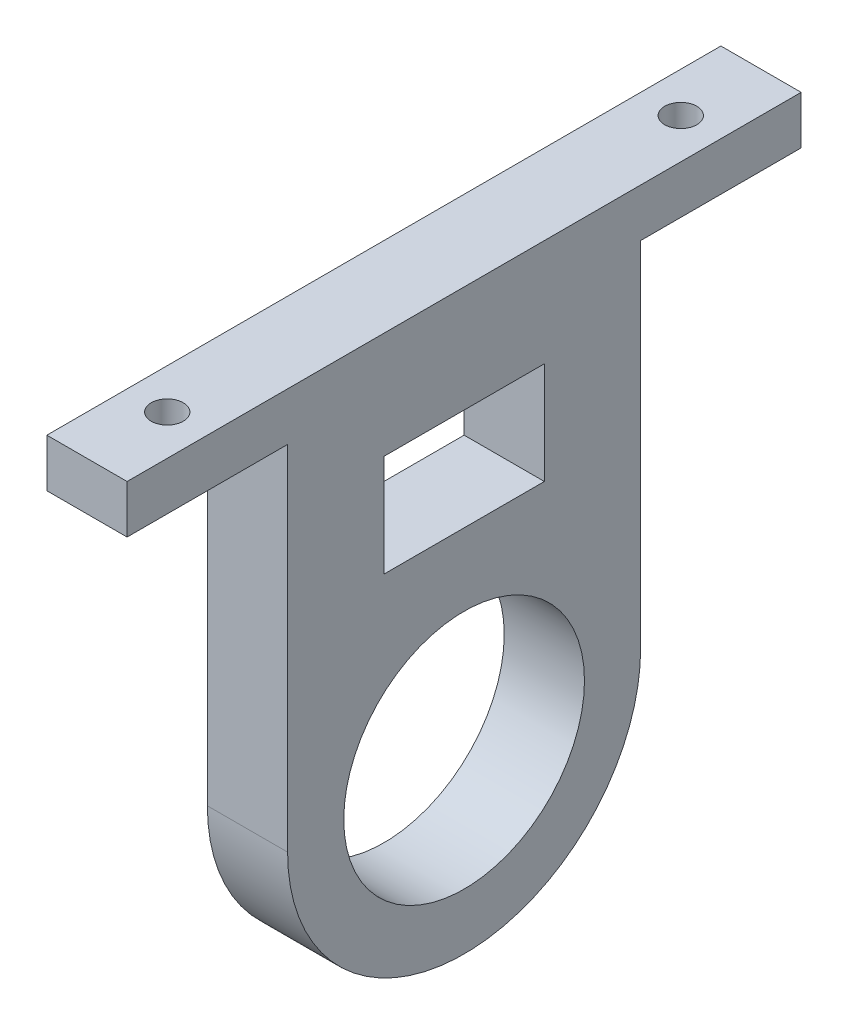
ISO-10303-21;
HEADER;
FILE_DESCRIPTION(('STEP AP214'),'2;1');
FILE_NAME('part.step','',(''),(''),'','','');
FILE_SCHEMA(('AUTOMOTIVE_DESIGN { 1 0 10303 214 1 1 1 1 }'));
ENDSEC;
DATA;
#1=APPLICATION_CONTEXT('core data for automotive mechanical design processes');
#2=APPLICATION_PROTOCOL_DEFINITION('international standard','automotive_design',2000,#1);
#3=PRODUCT_CONTEXT('',#1,'mechanical');
#4=PRODUCT('Part','Part','',(#3));
#5=PRODUCT_RELATED_PRODUCT_CATEGORY('part','',(#4));
#6=PRODUCT_DEFINITION_FORMATION('','',#4);
#7=PRODUCT_DEFINITION_CONTEXT('part definition',#1,'design');
#8=PRODUCT_DEFINITION('design','',#6,#7);
#9=PRODUCT_DEFINITION_SHAPE('','',#8);
#10=(LENGTH_UNIT() NAMED_UNIT(*) SI_UNIT(.MILLI.,.METRE.));
#11=(NAMED_UNIT(*) PLANE_ANGLE_UNIT() SI_UNIT($,.RADIAN.));
#12=(NAMED_UNIT(*) SI_UNIT($,.STERADIAN.) SOLID_ANGLE_UNIT());
#13=UNCERTAINTY_MEASURE_WITH_UNIT(LENGTH_MEASURE(1.E-05),#10,'distance_accuracy_value','');
#14=(GEOMETRIC_REPRESENTATION_CONTEXT(3) GLOBAL_UNCERTAINTY_ASSIGNED_CONTEXT((#13)) GLOBAL_UNIT_ASSIGNED_CONTEXT((#10,
#11,#12)) REPRESENTATION_CONTEXT('',''));
#15=CARTESIAN_POINT('',(0.,0.,0.));
#16=DIRECTION('',(0.,0.,1.));
#17=DIRECTION('',(1.,0.,0.));
#18=AXIS2_PLACEMENT_3D('',#15,#16,#17);
#19=CARTESIAN_POINT('',(5.,0.,0.));
#20=DIRECTION('',(1.,0.,0.));
#21=DIRECTION('',(0.,0.,-1.));
#22=AXIS2_PLACEMENT_3D('',#19,#20,#21);
#23=PLANE('',#22);
#24=CARTESIAN_POINT('',(5.,0.,0.));
#25=DIRECTION('',(1.,0.,0.));
#26=DIRECTION('',(0.,0.,-1.));
#27=AXIS2_PLACEMENT_3D('',#24,#25,#26);
#28=CIRCLE('',#27,11.);
#29=CARTESIAN_POINT('',(5.,0.,11.));
#30=VERTEX_POINT('',#29);
#31=CARTESIAN_POINT('',(5.,0.,-11.));
#32=VERTEX_POINT('',#31);
#33=EDGE_CURVE('E12',#30,#32,#28,.T.);
#34=ORIENTED_EDGE('',*,*,#33,.T.);
#35=DIRECTION('',(0.,1.,0.));
#36=VECTOR('',#35,1.);
#37=CARTESIAN_POINT('',(5.,0.,-11.));
#38=LINE('',#37,#36);
#39=CARTESIAN_POINT('',(5.,22.,-11.));
#40=VERTEX_POINT('',#39);
#41=EDGE_CURVE('E217',#32,#40,#38,.T.);
#42=ORIENTED_EDGE('',*,*,#41,.T.);
#43=DIRECTION('',(0.,0.,1.));
#44=VECTOR('',#43,1.);
#45=CARTESIAN_POINT('',(5.,22.,-21.));
#46=LINE('',#45,#44);
#47=CARTESIAN_POINT('',(5.,22.,-21.));
#48=VERTEX_POINT('',#47);
#49=EDGE_CURVE('E212',#48,#40,#46,.T.);
#50=ORIENTED_EDGE('',*,*,#49,.F.);
#51=DIRECTION('',(0.,-1.,0.));
#52=VECTOR('',#51,1.);
#53=CARTESIAN_POINT('',(5.,25.,-21.));
#54=LINE('',#53,#52);
#55=CARTESIAN_POINT('',(5.,25.,-21.));
#56=VERTEX_POINT('',#55);
#57=EDGE_CURVE('E204',#56,#48,#54,.T.);
#58=ORIENTED_EDGE('',*,*,#57,.F.);
#59=DIRECTION('',(0.,0.,-1.));
#60=VECTOR('',#59,1.);
#61=CARTESIAN_POINT('',(5.,25.,0.));
#62=LINE('',#61,#60);
#63=CARTESIAN_POINT('',(5.,25.,21.));
#64=VERTEX_POINT('',#63);
#65=EDGE_CURVE('E221',#64,#56,#62,.T.);
#66=ORIENTED_EDGE('',*,*,#65,.F.);
#67=DIRECTION('',(0.,-1.,0.));
#68=VECTOR('',#67,1.);
#69=CARTESIAN_POINT('',(5.,25.,21.));
#70=LINE('',#69,#68);
#71=CARTESIAN_POINT('',(5.,22.,21.));
#72=VERTEX_POINT('',#71);
#73=EDGE_CURVE('E185',#64,#72,#70,.T.);
#74=ORIENTED_EDGE('',*,*,#73,.T.);
#75=DIRECTION('',(0.,0.,1.));
#76=VECTOR('',#75,1.);
#77=CARTESIAN_POINT('',(5.,22.,11.));
#78=LINE('',#77,#76);
#79=CARTESIAN_POINT('',(5.,22.,11.));
#80=VERTEX_POINT('',#79);
#81=EDGE_CURVE('E190',#80,#72,#78,.T.);
#82=ORIENTED_EDGE('',*,*,#81,.F.);
#83=DIRECTION('',(0.,1.,0.));
#84=VECTOR('',#83,1.);
#85=CARTESIAN_POINT('',(5.,0.,11.));
#86=LINE('',#85,#84);
#87=EDGE_CURVE('E215',#30,#80,#86,.T.);
#88=ORIENTED_EDGE('',*,*,#87,.F.);
#89=EDGE_LOOP('',(#34,#42,#50,#58,#66,#74,#82,#88));
#90=FACE_BOUND('',#89,.T.);
#91=CARTESIAN_POINT('',(5.,0.,0.));
#92=DIRECTION('',(1.,0.,0.));
#93=DIRECTION('',(0.,0.,-1.));
#94=AXIS2_PLACEMENT_3D('',#91,#92,#93);
#95=CIRCLE('',#94,7.5);
#96=CARTESIAN_POINT('',(5.,0.,-7.5));
#97=VERTEX_POINT('',#96);
#98=EDGE_CURVE('E236',#97,#97,#95,.T.);
#99=ORIENTED_EDGE('',*,*,#98,.F.);
#100=EDGE_LOOP('',(#99));
#101=FACE_BOUND('',#100,.T.);
#102=DIRECTION('',(0.,1.,0.));
#103=VECTOR('',#102,1.);
#104=CARTESIAN_POINT('',(5.,12.,5.));
#105=LINE('',#104,#103);
#106=CARTESIAN_POINT('',(5.,12.,5.));
#107=VERTEX_POINT('',#106);
#108=CARTESIAN_POINT('',(5.,18.3540248627732,5.));
#109=VERTEX_POINT('',#108);
#110=EDGE_CURVE('E146',#107,#109,#105,.T.);
#111=ORIENTED_EDGE('',*,*,#110,.T.);
#112=DIRECTION('',(0.,0.,-1.));
#113=VECTOR('',#112,1.);
#114=CARTESIAN_POINT('',(5.,18.3540248627732,5.));
#115=LINE('',#114,#113);
#116=CARTESIAN_POINT('',(5.,18.3540248627732,-5.));
#117=VERTEX_POINT('',#116);
#118=EDGE_CURVE('E63',#109,#117,#115,.T.);
#119=ORIENTED_EDGE('',*,*,#118,.T.);
#120=DIRECTION('',(0.,1.,0.));
#121=VECTOR('',#120,1.);
#122=CARTESIAN_POINT('',(5.,12.,-5.));
#123=LINE('',#122,#121);
#124=CARTESIAN_POINT('',(5.,12.,-5.));
#125=VERTEX_POINT('',#124);
#126=EDGE_CURVE('E152',#125,#117,#123,.T.);
#127=ORIENTED_EDGE('',*,*,#126,.F.);
#128=DIRECTION('',(0.,0.,-1.));
#129=VECTOR('',#128,1.);
#130=CARTESIAN_POINT('',(5.,12.,5.));
#131=LINE('',#130,#129);
#132=EDGE_CURVE('E164',#107,#125,#131,.T.);
#133=ORIENTED_EDGE('',*,*,#132,.F.);
#134=EDGE_LOOP('',(#111,#119,#127,#133));
#135=FACE_BOUND('',#134,.T.);
#136=ADVANCED_FACE('F46',(#90,#101,#135),#23,.T.);
#137=CARTESIAN_POINT('',(0.,0.,0.));
#138=DIRECTION('',(1.,0.,0.));
#139=DIRECTION('',(0.,0.,-1.));
#140=AXIS2_PLACEMENT_3D('',#137,#138,#139);
#141=PLANE('',#140);
#142=CARTESIAN_POINT('',(0.,0.,0.));
#143=DIRECTION('',(1.,0.,0.));
#144=DIRECTION('',(0.,0.,-1.));
#145=AXIS2_PLACEMENT_3D('',#142,#143,#144);
#146=CIRCLE('',#145,7.5);
#147=CARTESIAN_POINT('',(0.,0.,-7.5));
#148=VERTEX_POINT('',#147);
#149=EDGE_CURVE('E235',#148,#148,#146,.T.);
#150=ORIENTED_EDGE('',*,*,#149,.T.);
#151=EDGE_LOOP('',(#150));
#152=FACE_BOUND('',#151,.T.);
#153=CARTESIAN_POINT('',(0.,0.,0.));
#154=DIRECTION('',(1.,0.,0.));
#155=DIRECTION('',(0.,0.,-1.));
#156=AXIS2_PLACEMENT_3D('',#153,#154,#155);
#157=CIRCLE('',#156,11.);
#158=CARTESIAN_POINT('',(0.,0.,11.));
#159=VERTEX_POINT('',#158);
#160=CARTESIAN_POINT('',(0.,0.,-11.));
#161=VERTEX_POINT('',#160);
#162=EDGE_CURVE('E55',#159,#161,#157,.T.);
#163=ORIENTED_EDGE('',*,*,#162,.F.);
#164=DIRECTION('',(0.,1.,0.));
#165=VECTOR('',#164,1.);
#166=CARTESIAN_POINT('',(0.,0.,11.));
#167=LINE('',#166,#165);
#168=CARTESIAN_POINT('',(0.,22.,11.));
#169=VERTEX_POINT('',#168);
#170=EDGE_CURVE('E214',#159,#169,#167,.T.);
#171=ORIENTED_EDGE('',*,*,#170,.T.);
#172=DIRECTION('',(0.,0.,1.));
#173=VECTOR('',#172,1.);
#174=CARTESIAN_POINT('',(0.,22.,11.));
#175=LINE('',#174,#173);
#176=CARTESIAN_POINT('',(0.,22.,21.));
#177=VERTEX_POINT('',#176);
#178=EDGE_CURVE('E177',#169,#177,#175,.T.);
#179=ORIENTED_EDGE('',*,*,#178,.T.);
#180=DIRECTION('',(0.,1.,0.));
#181=VECTOR('',#180,1.);
#182=CARTESIAN_POINT('',(0.,25.,21.));
#183=LINE('',#182,#181);
#184=CARTESIAN_POINT('',(0.,25.,21.));
#185=VERTEX_POINT('',#184);
#186=EDGE_CURVE('E179',#177,#185,#183,.T.);
#187=ORIENTED_EDGE('',*,*,#186,.T.);
#188=DIRECTION('',(0.,0.,-1.));
#189=VECTOR('',#188,1.);
#190=CARTESIAN_POINT('',(0.,25.,0.));
#191=LINE('',#190,#189);
#192=CARTESIAN_POINT('',(0.,25.,-21.));
#193=VERTEX_POINT('',#192);
#194=EDGE_CURVE('E218',#185,#193,#191,.T.);
#195=ORIENTED_EDGE('',*,*,#194,.T.);
#196=DIRECTION('',(0.,1.,0.));
#197=VECTOR('',#196,1.);
#198=CARTESIAN_POINT('',(0.,25.,-21.));
#199=LINE('',#198,#197);
#200=CARTESIAN_POINT('',(0.,22.,-21.));
#201=VERTEX_POINT('',#200);
#202=EDGE_CURVE('E197',#201,#193,#199,.T.);
#203=ORIENTED_EDGE('',*,*,#202,.F.);
#204=DIRECTION('',(0.,0.,1.));
#205=VECTOR('',#204,1.);
#206=CARTESIAN_POINT('',(0.,22.,-21.));
#207=LINE('',#206,#205);
#208=CARTESIAN_POINT('',(0.,22.,-11.));
#209=VERTEX_POINT('',#208);
#210=EDGE_CURVE('E208',#201,#209,#207,.T.);
#211=ORIENTED_EDGE('',*,*,#210,.T.);
#212=DIRECTION('',(0.,1.,0.));
#213=VECTOR('',#212,1.);
#214=CARTESIAN_POINT('',(0.,0.,-11.));
#215=LINE('',#214,#213);
#216=EDGE_CURVE('E226',#161,#209,#215,.T.);
#217=ORIENTED_EDGE('',*,*,#216,.F.);
#218=EDGE_LOOP('',(#163,#171,#179,#187,#195,#203,#211,#217));
#219=FACE_BOUND('',#218,.T.);
#220=DIRECTION('',(0.,0.,-1.));
#221=VECTOR('',#220,1.);
#222=CARTESIAN_POINT('',(0.,18.3540248627732,5.));
#223=LINE('',#222,#221);
#224=CARTESIAN_POINT('',(0.,18.3540248627732,5.));
#225=VERTEX_POINT('',#224);
#226=CARTESIAN_POINT('',(0.,18.3540248627732,-5.));
#227=VERTEX_POINT('',#226);
#228=EDGE_CURVE('E136',#225,#227,#223,.T.);
#229=ORIENTED_EDGE('',*,*,#228,.F.);
#230=DIRECTION('',(0.,1.,0.));
#231=VECTOR('',#230,1.);
#232=CARTESIAN_POINT('',(0.,12.,5.));
#233=LINE('',#232,#231);
#234=CARTESIAN_POINT('',(0.,12.,5.));
#235=VERTEX_POINT('',#234);
#236=EDGE_CURVE('E158',#235,#225,#233,.T.);
#237=ORIENTED_EDGE('',*,*,#236,.F.);
#238=DIRECTION('',(0.,0.,-1.));
#239=VECTOR('',#238,1.);
#240=CARTESIAN_POINT('',(0.,12.,5.));
#241=LINE('',#240,#239);
#242=CARTESIAN_POINT('',(0.,12.,-5.));
#243=VERTEX_POINT('',#242);
#244=EDGE_CURVE('E71',#235,#243,#241,.T.);
#245=ORIENTED_EDGE('',*,*,#244,.T.);
#246=DIRECTION('',(0.,1.,0.));
#247=VECTOR('',#246,1.);
#248=CARTESIAN_POINT('',(0.,12.,-5.));
#249=LINE('',#248,#247);
#250=EDGE_CURVE('E145',#243,#227,#249,.T.);
#251=ORIENTED_EDGE('',*,*,#250,.T.);
#252=EDGE_LOOP('',(#229,#237,#245,#251));
#253=FACE_BOUND('',#252,.T.);
#254=ADVANCED_FACE('F156',(#152,#219,#253),#141,.F.);
#255=CARTESIAN_POINT('',(5.,0.,11.));
#256=DIRECTION('',(0.,0.,1.));
#257=DIRECTION('',(1.,0.,0.));
#258=AXIS2_PLACEMENT_3D('',#255,#256,#257);
#259=PLANE('',#258);
#260=ORIENTED_EDGE('',*,*,#87,.T.);
#261=DIRECTION('',(-1.,0.,0.));
#262=VECTOR('',#261,1.);
#263=CARTESIAN_POINT('',(0.,22.,11.));
#264=LINE('',#263,#262);
#265=EDGE_CURVE('E175',#80,#169,#264,.T.);
#266=ORIENTED_EDGE('',*,*,#265,.T.);
#267=ORIENTED_EDGE('',*,*,#170,.F.);
#268=DIRECTION('',(-1.,0.,0.));
#269=VECTOR('',#268,1.);
#270=CARTESIAN_POINT('',(5.,0.,11.));
#271=LINE('',#270,#269);
#272=EDGE_CURVE('E232',#30,#159,#271,.T.);
#273=ORIENTED_EDGE('',*,*,#272,.F.);
#274=EDGE_LOOP('',(#260,#266,#267,#273));
#275=FACE_BOUND('',#274,.T.);
#276=ADVANCED_FACE('F268',(#275),#259,.T.);
#277=CARTESIAN_POINT('',(5.,0.,-11.));
#278=DIRECTION('',(0.,0.,1.));
#279=DIRECTION('',(1.,0.,0.));
#280=AXIS2_PLACEMENT_3D('',#277,#278,#279);
#281=PLANE('',#280);
#282=DIRECTION('',(-1.,0.,0.));
#283=VECTOR('',#282,1.);
#284=CARTESIAN_POINT('',(0.,22.,-11.));
#285=LINE('',#284,#283);
#286=EDGE_CURVE('E201',#40,#209,#285,.T.);
#287=ORIENTED_EDGE('',*,*,#286,.F.);
#288=ORIENTED_EDGE('',*,*,#41,.F.);
#289=DIRECTION('',(-1.,0.,0.));
#290=VECTOR('',#289,1.);
#291=CARTESIAN_POINT('',(5.,0.,-11.));
#292=LINE('',#291,#290);
#293=EDGE_CURVE('E223',#32,#161,#292,.T.);
#294=ORIENTED_EDGE('',*,*,#293,.T.);
#295=ORIENTED_EDGE('',*,*,#216,.T.);
#296=EDGE_LOOP('',(#287,#288,#294,#295));
#297=FACE_BOUND('',#296,.T.);
#298=ADVANCED_FACE('F279',(#297),#281,.F.);
#299=CARTESIAN_POINT('',(5.,0.,0.));
#300=DIRECTION('',(-1.,0.,0.));
#301=DIRECTION('',(0.,0.,1.));
#302=AXIS2_PLACEMENT_3D('',#299,#300,#301);
#303=CYLINDRICAL_SURFACE('',#302,11.);
#304=ORIENTED_EDGE('',*,*,#33,.F.);
#305=ORIENTED_EDGE('',*,*,#272,.T.);
#306=ORIENTED_EDGE('',*,*,#162,.T.);
#307=ORIENTED_EDGE('',*,*,#293,.F.);
#308=EDGE_LOOP('',(#304,#305,#306,#307));
#309=FACE_BOUND('',#308,.T.);
#310=ADVANCED_FACE('F48',(#309),#303,.T.);
#311=CARTESIAN_POINT('',(5.,0.,0.));
#312=DIRECTION('',(-1.,0.,0.));
#313=DIRECTION('',(0.,0.,1.));
#314=AXIS2_PLACEMENT_3D('',#311,#312,#313);
#315=CYLINDRICAL_SURFACE('',#314,7.5);
#316=ORIENTED_EDGE('',*,*,#98,.T.);
#317=EDGE_LOOP('',(#316));
#318=FACE_BOUND('',#317,.T.);
#319=ORIENTED_EDGE('',*,*,#149,.F.);
#320=EDGE_LOOP('',(#319));
#321=FACE_BOUND('',#320,.T.);
#322=ADVANCED_FACE('F272',(#318,#321),#315,.F.);
#323=CARTESIAN_POINT('',(5.,25.,0.));
#324=DIRECTION('',(0.,1.,0.));
#325=DIRECTION('',(0.,0.,1.));
#326=AXIS2_PLACEMENT_3D('',#323,#324,#325);
#327=PLANE('',#326);
#328=CARTESIAN_POINT('',(2.5,25.,16.));
#329=DIRECTION('',(0.,1.,0.));
#330=DIRECTION('',(0.,0.,1.));
#331=AXIS2_PLACEMENT_3D('',#328,#329,#330);
#332=CIRCLE('',#331,1.);
#333=CARTESIAN_POINT('',(2.5,25.,17.));
#334=VERTEX_POINT('',#333);
#335=EDGE_CURVE('E153',#334,#334,#332,.T.);
#336=ORIENTED_EDGE('',*,*,#335,.F.);
#337=EDGE_LOOP('',(#336));
#338=FACE_BOUND('',#337,.T.);
#339=CARTESIAN_POINT('',(2.5,25.,-16.));
#340=DIRECTION('',(0.,1.,0.));
#341=DIRECTION('',(0.,0.,1.));
#342=AXIS2_PLACEMENT_3D('',#339,#340,#341);
#343=CIRCLE('',#342,1.);
#344=CARTESIAN_POINT('',(2.5,25.,-15.));
#345=VERTEX_POINT('',#344);
#346=EDGE_CURVE('E193',#345,#345,#343,.T.);
#347=ORIENTED_EDGE('',*,*,#346,.F.);
#348=EDGE_LOOP('',(#347));
#349=FACE_BOUND('',#348,.T.);
#350=ORIENTED_EDGE('',*,*,#194,.F.);
#351=DIRECTION('',(1.,0.,0.));
#352=VECTOR('',#351,1.);
#353=CARTESIAN_POINT('',(0.,25.,21.));
#354=LINE('',#353,#352);
#355=EDGE_CURVE('E182',#185,#64,#354,.T.);
#356=ORIENTED_EDGE('',*,*,#355,.T.);
#357=ORIENTED_EDGE('',*,*,#65,.T.);
#358=DIRECTION('',(1.,0.,0.));
#359=VECTOR('',#358,1.);
#360=CARTESIAN_POINT('',(0.,25.,-21.));
#361=LINE('',#360,#359);
#362=EDGE_CURVE('E200',#193,#56,#361,.T.);
#363=ORIENTED_EDGE('',*,*,#362,.F.);
#364=EDGE_LOOP('',(#350,#356,#357,#363));
#365=FACE_BOUND('',#364,.T.);
#366=ADVANCED_FACE('F275',(#338,#349,#365),#327,.T.);
#367=CARTESIAN_POINT('',(0.,22.,-21.));
#368=DIRECTION('',(0.,1.,0.));
#369=DIRECTION('',(0.,0.,1.));
#370=AXIS2_PLACEMENT_3D('',#367,#368,#369);
#371=PLANE('',#370);
#372=CARTESIAN_POINT('',(2.5,22.,-16.));
#373=DIRECTION('',(0.,1.,0.));
#374=DIRECTION('',(0.,0.,1.));
#375=AXIS2_PLACEMENT_3D('',#372,#373,#374);
#376=CIRCLE('',#375,1.);
#377=CARTESIAN_POINT('',(2.5,22.,-15.));
#378=VERTEX_POINT('',#377);
#379=EDGE_CURVE('E196',#378,#378,#376,.T.);
#380=ORIENTED_EDGE('',*,*,#379,.T.);
#381=EDGE_LOOP('',(#380));
#382=FACE_BOUND('',#381,.T.);
#383=ORIENTED_EDGE('',*,*,#286,.T.);
#384=ORIENTED_EDGE('',*,*,#210,.F.);
#385=DIRECTION('',(-1.,0.,0.));
#386=VECTOR('',#385,1.);
#387=CARTESIAN_POINT('',(0.,22.,-21.));
#388=LINE('',#387,#386);
#389=EDGE_CURVE('E206',#48,#201,#388,.T.);
#390=ORIENTED_EDGE('',*,*,#389,.F.);
#391=ORIENTED_EDGE('',*,*,#49,.T.);
#392=EDGE_LOOP('',(#383,#384,#390,#391));
#393=FACE_BOUND('',#392,.T.);
#394=ADVANCED_FACE('F244',(#382,#393),#371,.F.);
#395=CARTESIAN_POINT('',(0.,0.,-21.));
#396=DIRECTION('',(0.,0.,1.));
#397=DIRECTION('',(1.,0.,0.));
#398=AXIS2_PLACEMENT_3D('',#395,#396,#397);
#399=PLANE('',#398);
#400=ORIENTED_EDGE('',*,*,#202,.T.);
#401=ORIENTED_EDGE('',*,*,#362,.T.);
#402=ORIENTED_EDGE('',*,*,#57,.T.);
#403=ORIENTED_EDGE('',*,*,#389,.T.);
#404=EDGE_LOOP('',(#400,#401,#402,#403));
#405=FACE_BOUND('',#404,.T.);
#406=ADVANCED_FACE('F250',(#405),#399,.F.);
#407=CARTESIAN_POINT('',(2.5,20.,-16.));
#408=DIRECTION('',(0.,1.,0.));
#409=DIRECTION('',(0.,0.,1.));
#410=AXIS2_PLACEMENT_3D('',#407,#408,#409);
#411=CYLINDRICAL_SURFACE('',#410,1.);
#412=ORIENTED_EDGE('',*,*,#346,.T.);
#413=EDGE_LOOP('',(#412));
#414=FACE_BOUND('',#413,.T.);
#415=ORIENTED_EDGE('',*,*,#379,.F.);
#416=EDGE_LOOP('',(#415));
#417=FACE_BOUND('',#416,.T.);
#418=ADVANCED_FACE('F247',(#414,#417),#411,.F.);
#419=CARTESIAN_POINT('',(0.,22.,11.));
#420=DIRECTION('',(0.,1.,0.));
#421=DIRECTION('',(0.,0.,1.));
#422=AXIS2_PLACEMENT_3D('',#419,#420,#421);
#423=PLANE('',#422);
#424=CARTESIAN_POINT('',(2.5,22.,16.));
#425=DIRECTION('',(0.,1.,0.));
#426=DIRECTION('',(0.,0.,1.));
#427=AXIS2_PLACEMENT_3D('',#424,#425,#426);
#428=CIRCLE('',#427,1.);
#429=CARTESIAN_POINT('',(2.5,22.,17.));
#430=VERTEX_POINT('',#429);
#431=EDGE_CURVE('E50',#430,#430,#428,.T.);
#432=ORIENTED_EDGE('',*,*,#431,.T.);
#433=EDGE_LOOP('',(#432));
#434=FACE_BOUND('',#433,.T.);
#435=DIRECTION('',(-1.,0.,0.));
#436=VECTOR('',#435,1.);
#437=CARTESIAN_POINT('',(0.,22.,21.));
#438=LINE('',#437,#436);
#439=EDGE_CURVE('E178',#72,#177,#438,.T.);
#440=ORIENTED_EDGE('',*,*,#439,.T.);
#441=ORIENTED_EDGE('',*,*,#178,.F.);
#442=ORIENTED_EDGE('',*,*,#265,.F.);
#443=ORIENTED_EDGE('',*,*,#81,.T.);
#444=EDGE_LOOP('',(#440,#441,#442,#443));
#445=FACE_BOUND('',#444,.T.);
#446=ADVANCED_FACE('F249',(#434,#445),#423,.F.);
#447=CARTESIAN_POINT('',(0.,0.,21.));
#448=DIRECTION('',(0.,0.,1.));
#449=DIRECTION('',(1.,0.,0.));
#450=AXIS2_PLACEMENT_3D('',#447,#448,#449);
#451=PLANE('',#450);
#452=ORIENTED_EDGE('',*,*,#186,.F.);
#453=ORIENTED_EDGE('',*,*,#439,.F.);
#454=ORIENTED_EDGE('',*,*,#73,.F.);
#455=ORIENTED_EDGE('',*,*,#355,.F.);
#456=EDGE_LOOP('',(#452,#453,#454,#455));
#457=FACE_BOUND('',#456,.T.);
#458=ADVANCED_FACE('F257',(#457),#451,.T.);
#459=CARTESIAN_POINT('',(2.5,20.,16.));
#460=DIRECTION('',(0.,1.,0.));
#461=DIRECTION('',(0.,0.,1.));
#462=AXIS2_PLACEMENT_3D('',#459,#460,#461);
#463=CYLINDRICAL_SURFACE('',#462,1.);
#464=ORIENTED_EDGE('',*,*,#335,.T.);
#465=EDGE_LOOP('',(#464));
#466=FACE_BOUND('',#465,.T.);
#467=ORIENTED_EDGE('',*,*,#431,.F.);
#468=EDGE_LOOP('',(#467));
#469=FACE_BOUND('',#468,.T.);
#470=ADVANCED_FACE('F348',(#466,#469),#463,.F.);
#471=CARTESIAN_POINT('',(0.,18.3540248627732,5.));
#472=DIRECTION('',(0.,-1.,0.));
#473=DIRECTION('',(0.,0.,-1.));
#474=AXIS2_PLACEMENT_3D('',#471,#472,#473);
#475=PLANE('',#474);
#476=ORIENTED_EDGE('',*,*,#118,.F.);
#477=DIRECTION('',(1.,0.,0.));
#478=VECTOR('',#477,1.);
#479=CARTESIAN_POINT('',(0.,18.3540248627732,5.));
#480=LINE('',#479,#478);
#481=EDGE_CURVE('E141',#225,#109,#480,.T.);
#482=ORIENTED_EDGE('',*,*,#481,.F.);
#483=ORIENTED_EDGE('',*,*,#228,.T.);
#484=DIRECTION('',(1.,0.,0.));
#485=VECTOR('',#484,1.);
#486=CARTESIAN_POINT('',(0.,18.3540248627732,-5.));
#487=LINE('',#486,#485);
#488=EDGE_CURVE('E139',#227,#117,#487,.T.);
#489=ORIENTED_EDGE('',*,*,#488,.T.);
#490=EDGE_LOOP('',(#476,#482,#483,#489));
#491=FACE_BOUND('',#490,.T.);
#492=ADVANCED_FACE('F138',(#491),#475,.T.);
#493=CARTESIAN_POINT('',(0.,12.,-5.));
#494=DIRECTION('',(0.,0.,-1.));
#495=DIRECTION('',(-1.,0.,0.));
#496=AXIS2_PLACEMENT_3D('',#493,#494,#495);
#497=PLANE('',#496);
#498=ORIENTED_EDGE('',*,*,#126,.T.);
#499=ORIENTED_EDGE('',*,*,#488,.F.);
#500=ORIENTED_EDGE('',*,*,#250,.F.);
#501=DIRECTION('',(1.,0.,0.));
#502=VECTOR('',#501,1.);
#503=CARTESIAN_POINT('',(0.,12.,-5.));
#504=LINE('',#503,#502);
#505=EDGE_CURVE('E154',#243,#125,#504,.T.);
#506=ORIENTED_EDGE('',*,*,#505,.T.);
#507=EDGE_LOOP('',(#498,#499,#500,#506));
#508=FACE_BOUND('',#507,.T.);
#509=ADVANCED_FACE('F150',(#508),#497,.F.);
#510=CARTESIAN_POINT('',(0.,12.,5.));
#511=DIRECTION('',(0.,-1.,0.));
#512=DIRECTION('',(0.,0.,-1.));
#513=AXIS2_PLACEMENT_3D('',#510,#511,#512);
#514=PLANE('',#513);
#515=ORIENTED_EDGE('',*,*,#132,.T.);
#516=ORIENTED_EDGE('',*,*,#505,.F.);
#517=ORIENTED_EDGE('',*,*,#244,.F.);
#518=DIRECTION('',(1.,0.,0.));
#519=VECTOR('',#518,1.);
#520=CARTESIAN_POINT('',(0.,12.,5.));
#521=LINE('',#520,#519);
#522=EDGE_CURVE('E170',#235,#107,#521,.T.);
#523=ORIENTED_EDGE('',*,*,#522,.T.);
#524=EDGE_LOOP('',(#515,#516,#517,#523));
#525=FACE_BOUND('',#524,.T.);
#526=ADVANCED_FACE('F399',(#525),#514,.F.);
#527=CARTESIAN_POINT('',(0.,12.,5.));
#528=DIRECTION('',(0.,0.,-1.));
#529=DIRECTION('',(-1.,0.,0.));
#530=AXIS2_PLACEMENT_3D('',#527,#528,#529);
#531=PLANE('',#530);
#532=ORIENTED_EDGE('',*,*,#110,.F.);
#533=ORIENTED_EDGE('',*,*,#522,.F.);
#534=ORIENTED_EDGE('',*,*,#236,.T.);
#535=ORIENTED_EDGE('',*,*,#481,.T.);
#536=EDGE_LOOP('',(#532,#533,#534,#535));
#537=FACE_BOUND('',#536,.T.);
#538=ADVANCED_FACE('F407',(#537),#531,.T.);
#539=CLOSED_SHELL('',(#136,#254,#276,#298,#310,#322,#366,#394,#406,#418,#446,#458,#470,#492,
#509,#526,#538));
#540=MANIFOLD_SOLID_BREP('B2',#539);
#541=ADVANCED_BREP_SHAPE_REPRESENTATION('',(#18,#540),#14);
#542=SHAPE_DEFINITION_REPRESENTATION(#9,#541);
ENDSEC;
END-ISO-10303-21;
